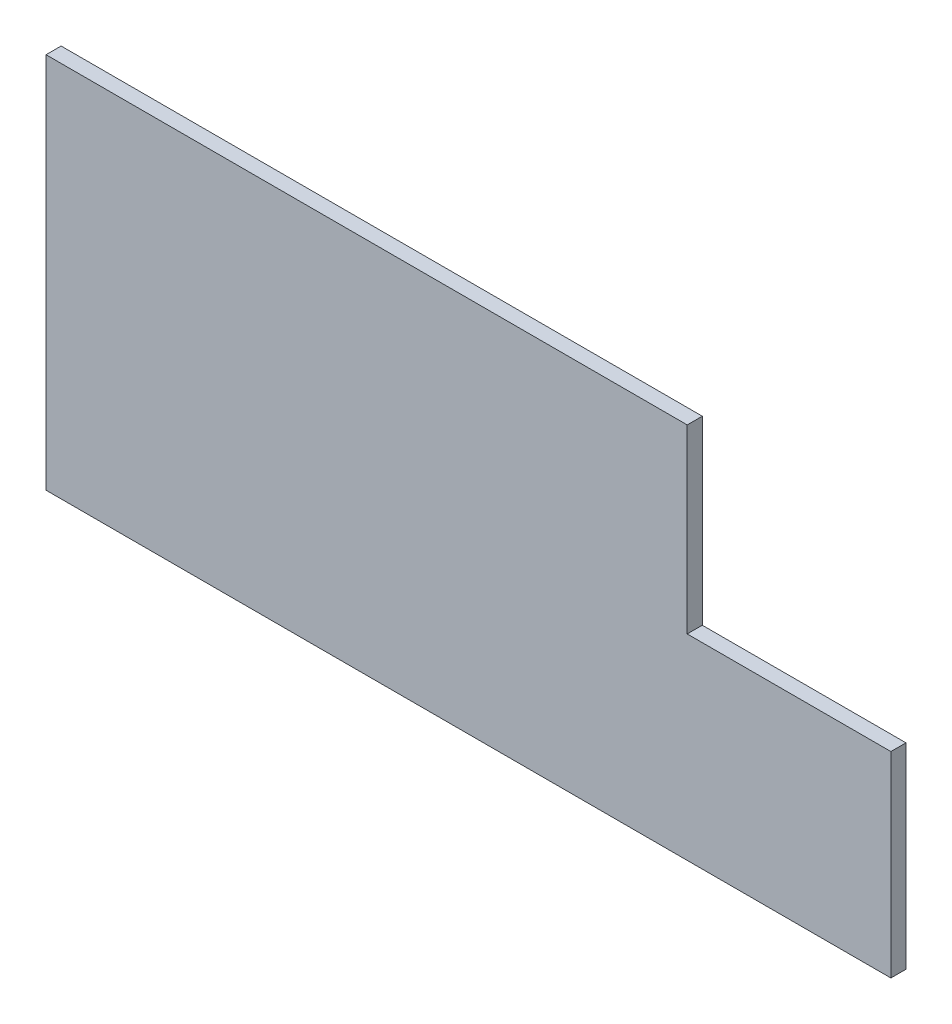
ISO-10303-21;
HEADER;
FILE_DESCRIPTION(('STEP AP214'),'2;1');
FILE_NAME('part.step','',(''),(''),'','','');
FILE_SCHEMA(('AUTOMOTIVE_DESIGN { 1 0 10303 214 1 1 1 1 }'));
ENDSEC;
DATA;
#1=APPLICATION_CONTEXT('core data for automotive mechanical design processes');
#2=APPLICATION_PROTOCOL_DEFINITION('international standard','automotive_design',2000,#1);
#3=PRODUCT_CONTEXT('',#1,'mechanical');
#4=PRODUCT('Part','Part','',(#3));
#5=PRODUCT_RELATED_PRODUCT_CATEGORY('part','',(#4));
#6=PRODUCT_DEFINITION_FORMATION('','',#4);
#7=PRODUCT_DEFINITION_CONTEXT('part definition',#1,'design');
#8=PRODUCT_DEFINITION('design','',#6,#7);
#9=PRODUCT_DEFINITION_SHAPE('','',#8);
#10=(LENGTH_UNIT() NAMED_UNIT(*) SI_UNIT(.MILLI.,.METRE.));
#11=(NAMED_UNIT(*) PLANE_ANGLE_UNIT() SI_UNIT($,.RADIAN.));
#12=(NAMED_UNIT(*) SI_UNIT($,.STERADIAN.) SOLID_ANGLE_UNIT());
#13=UNCERTAINTY_MEASURE_WITH_UNIT(LENGTH_MEASURE(1.E-05),#10,'distance_accuracy_value','');
#14=(GEOMETRIC_REPRESENTATION_CONTEXT(3) GLOBAL_UNCERTAINTY_ASSIGNED_CONTEXT((#13)) GLOBAL_UNIT_ASSIGNED_CONTEXT((#10,
#11,#12)) REPRESENTATION_CONTEXT('',''));
#15=CARTESIAN_POINT('',(0.,0.,0.));
#16=DIRECTION('',(0.,0.,1.));
#17=DIRECTION('',(1.,0.,0.));
#18=AXIS2_PLACEMENT_3D('',#15,#16,#17);
#19=CARTESIAN_POINT('',(66.4117070563079,48.6413043478261,4.));
#20=DIRECTION('',(-1.,0.,0.));
#21=DIRECTION('',(0.,0.,1.));
#22=AXIS2_PLACEMENT_3D('',#19,#20,#21);
#23=PLANE('',#22);
#24=DIRECTION('',(0.,0.,1.));
#25=VECTOR('',#24,1.);
#26=CARTESIAN_POINT('',(66.4117070563079,0.641304347826104,4.));
#27=LINE('',#26,#25);
#28=CARTESIAN_POINT('',(66.4117070563079,0.641304347826104,0.));
#29=VERTEX_POINT('',#28);
#30=CARTESIAN_POINT('',(66.4117070563079,0.641304347826104,4.));
#31=VERTEX_POINT('',#30);
#32=EDGE_CURVE('E56',#29,#31,#27,.T.);
#33=ORIENTED_EDGE('',*,*,#32,.F.);
#34=DIRECTION('',(0.,1.,0.));
#35=VECTOR('',#34,1.);
#36=CARTESIAN_POINT('',(66.4117070563079,48.6413043478261,0.));
#37=LINE('',#36,#35);
#38=CARTESIAN_POINT('',(66.4117070563079,48.6413043478261,0.));
#39=VERTEX_POINT('',#38);
#40=EDGE_CURVE('E147',#29,#39,#37,.T.);
#41=ORIENTED_EDGE('',*,*,#40,.T.);
#42=DIRECTION('',(0.,0.,-1.));
#43=VECTOR('',#42,1.);
#44=CARTESIAN_POINT('',(66.4117070563079,48.6413043478261,4.));
#45=LINE('',#44,#43);
#46=CARTESIAN_POINT('',(66.4117070563079,48.6413043478261,4.));
#47=VERTEX_POINT('',#46);
#48=EDGE_CURVE('E48',#47,#39,#45,.T.);
#49=ORIENTED_EDGE('',*,*,#48,.F.);
#50=DIRECTION('',(0.,1.,0.));
#51=VECTOR('',#50,1.);
#52=CARTESIAN_POINT('',(66.4117070563079,48.6413043478261,4.));
#53=LINE('',#52,#51);
#54=EDGE_CURVE('E109',#31,#47,#53,.T.);
#55=ORIENTED_EDGE('',*,*,#54,.F.);
#56=EDGE_LOOP('',(#33,#41,#49,#55));
#57=FACE_BOUND('',#56,.T.);
#58=ADVANCED_FACE('F39',(#57),#23,.F.);
#59=CARTESIAN_POINT('',(-103.588292943692,48.6413043478261,4.));
#60=DIRECTION('',(1.,0.,0.));
#61=DIRECTION('',(0.,0.,-1.));
#62=AXIS2_PLACEMENT_3D('',#59,#60,#61);
#63=PLANE('',#62);
#64=DIRECTION('',(0.,-1.,0.));
#65=VECTOR('',#64,1.);
#66=CARTESIAN_POINT('',(-103.588292943692,48.6413043478261,0.));
#67=LINE('',#66,#65);
#68=CARTESIAN_POINT('',(-103.588292943692,48.6413043478261,0.));
#69=VERTEX_POINT('',#68);
#70=CARTESIAN_POINT('',(-103.588292943692,-51.3586956521739,0.));
#71=VERTEX_POINT('',#70);
#72=EDGE_CURVE('E139',#69,#71,#67,.T.);
#73=ORIENTED_EDGE('',*,*,#72,.T.);
#74=DIRECTION('',(0.,0.,-1.));
#75=VECTOR('',#74,1.);
#76=CARTESIAN_POINT('',(-103.588292943692,-51.3586956521739,4.));
#77=LINE('',#76,#75);
#78=CARTESIAN_POINT('',(-103.588292943692,-51.3586956521739,4.));
#79=VERTEX_POINT('',#78);
#80=EDGE_CURVE('E11',#79,#71,#77,.T.);
#81=ORIENTED_EDGE('',*,*,#80,.F.);
#82=DIRECTION('',(0.,-1.,0.));
#83=VECTOR('',#82,1.);
#84=CARTESIAN_POINT('',(-103.588292943692,48.6413043478261,4.));
#85=LINE('',#84,#83);
#86=CARTESIAN_POINT('',(-103.588292943692,48.6413043478261,4.));
#87=VERTEX_POINT('',#86);
#88=EDGE_CURVE('E106',#87,#79,#85,.T.);
#89=ORIENTED_EDGE('',*,*,#88,.F.);
#90=DIRECTION('',(0.,0.,-1.));
#91=VECTOR('',#90,1.);
#92=CARTESIAN_POINT('',(-103.588292943692,48.6413043478261,4.));
#93=LINE('',#92,#91);
#94=EDGE_CURVE('E155',#87,#69,#93,.T.);
#95=ORIENTED_EDGE('',*,*,#94,.T.);
#96=EDGE_LOOP('',(#73,#81,#89,#95));
#97=FACE_BOUND('',#96,.T.);
#98=ADVANCED_FACE('F41',(#97),#63,.F.);
#99=CARTESIAN_POINT('',(-103.588292943692,-51.3586956521739,4.));
#100=DIRECTION('',(0.,1.,0.));
#101=DIRECTION('',(0.,0.,1.));
#102=AXIS2_PLACEMENT_3D('',#99,#100,#101);
#103=PLANE('',#102);
#104=DIRECTION('',(1.,0.,0.));
#105=VECTOR('',#104,1.);
#106=CARTESIAN_POINT('',(-103.588292943692,-51.3586956521739,0.));
#107=LINE('',#106,#105);
#108=CARTESIAN_POINT('',(120.411707056308,-51.3586956521739,0.));
#109=VERTEX_POINT('',#108);
#110=EDGE_CURVE('E114',#71,#109,#107,.T.);
#111=ORIENTED_EDGE('',*,*,#110,.T.);
#112=DIRECTION('',(0.,0.,-1.));
#113=VECTOR('',#112,1.);
#114=CARTESIAN_POINT('',(120.411707056308,-51.3586956521739,3.99999999999999));
#115=LINE('',#114,#113);
#116=CARTESIAN_POINT('',(120.411707056308,-51.3586956521739,3.99999999999999));
#117=VERTEX_POINT('',#116);
#118=EDGE_CURVE('E112',#117,#109,#115,.T.);
#119=ORIENTED_EDGE('',*,*,#118,.F.);
#120=DIRECTION('',(1.,0.,0.));
#121=VECTOR('',#120,1.);
#122=CARTESIAN_POINT('',(-103.588292943692,-51.3586956521739,4.));
#123=LINE('',#122,#121);
#124=EDGE_CURVE('E87',#79,#117,#123,.T.);
#125=ORIENTED_EDGE('',*,*,#124,.F.);
#126=ORIENTED_EDGE('',*,*,#80,.T.);
#127=EDGE_LOOP('',(#111,#119,#125,#126));
#128=FACE_BOUND('',#127,.T.);
#129=ADVANCED_FACE('F113',(#128),#103,.F.);
#130=CARTESIAN_POINT('',(-103.588292943692,48.6413043478261,4.));
#131=DIRECTION('',(0.,-1.,0.));
#132=DIRECTION('',(0.,0.,-1.));
#133=AXIS2_PLACEMENT_3D('',#130,#131,#132);
#134=PLANE('',#133);
#135=DIRECTION('',(-1.,0.,0.));
#136=VECTOR('',#135,1.);
#137=CARTESIAN_POINT('',(-103.588292943692,48.6413043478261,0.));
#138=LINE('',#137,#136);
#139=EDGE_CURVE('E81',#39,#69,#138,.T.);
#140=ORIENTED_EDGE('',*,*,#139,.T.);
#141=ORIENTED_EDGE('',*,*,#94,.F.);
#142=DIRECTION('',(-1.,0.,0.));
#143=VECTOR('',#142,1.);
#144=CARTESIAN_POINT('',(-103.588292943692,48.6413043478261,4.));
#145=LINE('',#144,#143);
#146=EDGE_CURVE('E65',#47,#87,#145,.T.);
#147=ORIENTED_EDGE('',*,*,#146,.F.);
#148=ORIENTED_EDGE('',*,*,#48,.T.);
#149=EDGE_LOOP('',(#140,#141,#147,#148));
#150=FACE_BOUND('',#149,.T.);
#151=ADVANCED_FACE('F159',(#150),#134,.F.);
#152=CARTESIAN_POINT('',(0.,0.,4.));
#153=DIRECTION('',(0.,0.,1.));
#154=DIRECTION('',(1.,0.,0.));
#155=AXIS2_PLACEMENT_3D('',#152,#153,#154);
#156=PLANE('',#155);
#157=ORIENTED_EDGE('',*,*,#88,.T.);
#158=ORIENTED_EDGE('',*,*,#124,.T.);
#159=DIRECTION('',(0.,-1.,0.));
#160=VECTOR('',#159,1.);
#161=CARTESIAN_POINT('',(120.411707056308,0.641304347826104,4.));
#162=LINE('',#161,#160);
#163=CARTESIAN_POINT('',(120.411707056308,0.641304347826104,4.));
#164=VERTEX_POINT('',#163);
#165=EDGE_CURVE('E104',#164,#117,#162,.T.);
#166=ORIENTED_EDGE('',*,*,#165,.F.);
#167=DIRECTION('',(-1.,0.,0.));
#168=VECTOR('',#167,1.);
#169=CARTESIAN_POINT('',(120.411707056308,0.641304347826104,4.));
#170=LINE('',#169,#168);
#171=EDGE_CURVE('E128',#164,#31,#170,.T.);
#172=ORIENTED_EDGE('',*,*,#171,.T.);
#173=ORIENTED_EDGE('',*,*,#54,.T.);
#174=ORIENTED_EDGE('',*,*,#146,.T.);
#175=EDGE_LOOP('',(#157,#158,#166,#172,#173,#174));
#176=FACE_BOUND('',#175,.T.);
#177=ADVANCED_FACE('F101',(#176),#156,.T.);
#178=CARTESIAN_POINT('',(0.,0.,0.));
#179=DIRECTION('',(0.,0.,1.));
#180=DIRECTION('',(1.,0.,0.));
#181=AXIS2_PLACEMENT_3D('',#178,#179,#180);
#182=PLANE('',#181);
#183=ORIENTED_EDGE('',*,*,#72,.F.);
#184=ORIENTED_EDGE('',*,*,#139,.F.);
#185=ORIENTED_EDGE('',*,*,#40,.F.);
#186=DIRECTION('',(-1.,0.,0.));
#187=VECTOR('',#186,1.);
#188=CARTESIAN_POINT('',(120.411707056308,0.641304347826104,0.));
#189=LINE('',#188,#187);
#190=CARTESIAN_POINT('',(120.411707056308,0.641304347826104,0.));
#191=VERTEX_POINT('',#190);
#192=EDGE_CURVE('E136',#191,#29,#189,.T.);
#193=ORIENTED_EDGE('',*,*,#192,.F.);
#194=DIRECTION('',(0.,1.,0.));
#195=VECTOR('',#194,1.);
#196=CARTESIAN_POINT('',(120.411707056308,0.641304347826104,0.));
#197=LINE('',#196,#195);
#198=EDGE_CURVE('E117',#109,#191,#197,.T.);
#199=ORIENTED_EDGE('',*,*,#198,.F.);
#200=ORIENTED_EDGE('',*,*,#110,.F.);
#201=EDGE_LOOP('',(#183,#184,#185,#193,#199,#200));
#202=FACE_BOUND('',#201,.T.);
#203=ADVANCED_FACE('F171',(#202),#182,.F.);
#204=CARTESIAN_POINT('',(120.411707056308,0.641304347826104,4.));
#205=DIRECTION('',(0.,-1.,0.));
#206=DIRECTION('',(0.,0.,-1.));
#207=AXIS2_PLACEMENT_3D('',#204,#205,#206);
#208=PLANE('',#207);
#209=ORIENTED_EDGE('',*,*,#32,.T.);
#210=ORIENTED_EDGE('',*,*,#171,.F.);
#211=DIRECTION('',(0.,0.,1.));
#212=VECTOR('',#211,1.);
#213=CARTESIAN_POINT('',(120.411707056308,0.641304347826104,4.));
#214=LINE('',#213,#212);
#215=EDGE_CURVE('E121',#191,#164,#214,.T.);
#216=ORIENTED_EDGE('',*,*,#215,.F.);
#217=ORIENTED_EDGE('',*,*,#192,.T.);
#218=EDGE_LOOP('',(#209,#210,#216,#217));
#219=FACE_BOUND('',#218,.T.);
#220=ADVANCED_FACE('F174',(#219),#208,.F.);
#221=CARTESIAN_POINT('',(120.411707056308,0.,0.));
#222=DIRECTION('',(1.,0.,0.));
#223=DIRECTION('',(0.,0.,-1.));
#224=AXIS2_PLACEMENT_3D('',#221,#222,#223);
#225=PLANE('',#224);
#226=ORIENTED_EDGE('',*,*,#165,.T.);
#227=ORIENTED_EDGE('',*,*,#118,.T.);
#228=ORIENTED_EDGE('',*,*,#198,.T.);
#229=ORIENTED_EDGE('',*,*,#215,.T.);
#230=EDGE_LOOP('',(#226,#227,#228,#229));
#231=FACE_BOUND('',#230,.T.);
#232=ADVANCED_FACE('F119',(#231),#225,.T.);
#233=CLOSED_SHELL('',(#58,#98,#129,#151,#177,#203,#220,#232));
#234=MANIFOLD_SOLID_BREP('B2',#233);
#235=ADVANCED_BREP_SHAPE_REPRESENTATION('',(#18,#234),#14);
#236=SHAPE_DEFINITION_REPRESENTATION(#9,#235);
ENDSEC;
END-ISO-10303-21;
